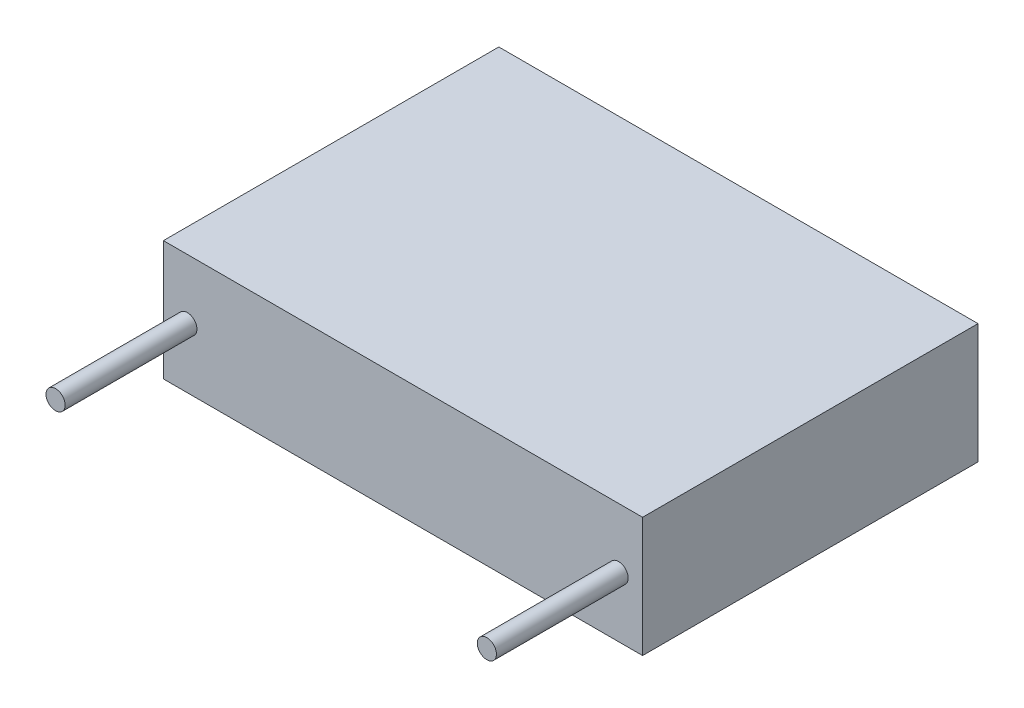
ISO-10303-21;
HEADER;
FILE_DESCRIPTION(('STEP AP214'),'2;1');
FILE_NAME('part.step','',(''),(''),'','','');
FILE_SCHEMA(('AUTOMOTIVE_DESIGN { 1 0 10303 214 1 1 1 1 }'));
ENDSEC;
DATA;
#1=APPLICATION_CONTEXT('core data for automotive mechanical design processes');
#2=APPLICATION_PROTOCOL_DEFINITION('international standard','automotive_design',2000,#1);
#3=PRODUCT_CONTEXT('',#1,'mechanical');
#4=PRODUCT('Part','Part','',(#3));
#5=PRODUCT_RELATED_PRODUCT_CATEGORY('part','',(#4));
#6=PRODUCT_DEFINITION_FORMATION('','',#4);
#7=PRODUCT_DEFINITION_CONTEXT('part definition',#1,'design');
#8=PRODUCT_DEFINITION('design','',#6,#7);
#9=PRODUCT_DEFINITION_SHAPE('','',#8);
#10=(LENGTH_UNIT() NAMED_UNIT(*) SI_UNIT(.MILLI.,.METRE.));
#11=(NAMED_UNIT(*) PLANE_ANGLE_UNIT() SI_UNIT($,.RADIAN.));
#12=(NAMED_UNIT(*) SI_UNIT($,.STERADIAN.) SOLID_ANGLE_UNIT());
#13=UNCERTAINTY_MEASURE_WITH_UNIT(LENGTH_MEASURE(1.E-05),#10,'distance_accuracy_value','');
#14=(GEOMETRIC_REPRESENTATION_CONTEXT(3) GLOBAL_UNCERTAINTY_ASSIGNED_CONTEXT((#13)) GLOBAL_UNIT_ASSIGNED_CONTEXT((#10,
#11,#12)) REPRESENTATION_CONTEXT('',''));
#15=CARTESIAN_POINT('',(0.,0.,0.));
#16=DIRECTION('',(0.,0.,1.));
#17=DIRECTION('',(1.,0.,0.));
#18=AXIS2_PLACEMENT_3D('',#15,#16,#17);
#19=CARTESIAN_POINT('',(0.,5.,14.));
#20=DIRECTION('',(0.,0.,-1.));
#21=DIRECTION('',(-1.,0.,0.));
#22=AXIS2_PLACEMENT_3D('',#19,#20,#21);
#23=PLANE('',#22);
#24=CARTESIAN_POINT('',(1.,2.5,14.));
#25=DIRECTION('',(0.,0.,-1.));
#26=DIRECTION('',(-1.,0.,0.));
#27=AXIS2_PLACEMENT_3D('',#24,#25,#26);
#28=CIRCLE('',#27,0.4);
#29=CARTESIAN_POINT('',(0.6,2.5,14.));
#30=VERTEX_POINT('',#29);
#31=EDGE_CURVE('E40',#30,#30,#28,.F.);
#32=ORIENTED_EDGE('',*,*,#31,.F.);
#33=EDGE_LOOP('',(#32));
#34=FACE_BOUND('',#33,.T.);
#35=DIRECTION('',(0.,-1.,0.));
#36=VECTOR('',#35,1.);
#37=CARTESIAN_POINT('',(0.,0.,14.));
#38=LINE('',#37,#36);
#39=CARTESIAN_POINT('',(0.,5.,14.));
#40=VERTEX_POINT('',#39);
#41=CARTESIAN_POINT('',(0.,0.,14.));
#42=VERTEX_POINT('',#41);
#43=EDGE_CURVE('E84',#40,#42,#38,.T.);
#44=ORIENTED_EDGE('',*,*,#43,.T.);
#45=DIRECTION('',(1.,0.,0.));
#46=VECTOR('',#45,1.);
#47=CARTESIAN_POINT('',(0.,0.,14.));
#48=LINE('',#47,#46);
#49=CARTESIAN_POINT('',(20.,0.,14.));
#50=VERTEX_POINT('',#49);
#51=EDGE_CURVE('E79',#42,#50,#48,.T.);
#52=ORIENTED_EDGE('',*,*,#51,.T.);
#53=DIRECTION('',(0.,1.,0.));
#54=VECTOR('',#53,1.);
#55=CARTESIAN_POINT('',(20.,0.,14.));
#56=LINE('',#55,#54);
#57=CARTESIAN_POINT('',(20.,5.,14.));
#58=VERTEX_POINT('',#57);
#59=EDGE_CURVE('E82',#50,#58,#56,.T.);
#60=ORIENTED_EDGE('',*,*,#59,.T.);
#61=DIRECTION('',(-1.,0.,0.));
#62=VECTOR('',#61,1.);
#63=CARTESIAN_POINT('',(0.,5.,14.));
#64=LINE('',#63,#62);
#65=EDGE_CURVE('E48',#58,#40,#64,.T.);
#66=ORIENTED_EDGE('',*,*,#65,.T.);
#67=EDGE_LOOP('',(#44,#52,#60,#66));
#68=FACE_BOUND('',#67,.T.);
#69=CARTESIAN_POINT('',(19.,2.5,14.));
#70=DIRECTION('',(0.,0.,-1.));
#71=DIRECTION('',(-1.,0.,0.));
#72=AXIS2_PLACEMENT_3D('',#69,#70,#71);
#73=CIRCLE('',#72,0.400000000000001);
#74=CARTESIAN_POINT('',(18.6,2.5,14.));
#75=VERTEX_POINT('',#74);
#76=EDGE_CURVE('E11',#75,#75,#73,.F.);
#77=ORIENTED_EDGE('',*,*,#76,.F.);
#78=EDGE_LOOP('',(#77));
#79=FACE_BOUND('',#78,.T.);
#80=ADVANCED_FACE('F31',(#34,#68,#79),#23,.F.);
#81=CARTESIAN_POINT('',(0.,0.,14.));
#82=DIRECTION('',(1.,0.,0.));
#83=DIRECTION('',(0.,0.,-1.));
#84=AXIS2_PLACEMENT_3D('',#81,#82,#83);
#85=PLANE('',#84);
#86=DIRECTION('',(0.,-1.,0.));
#87=VECTOR('',#86,1.);
#88=CARTESIAN_POINT('',(0.,0.,0.));
#89=LINE('',#88,#87);
#90=CARTESIAN_POINT('',(0.,5.,0.));
#91=VERTEX_POINT('',#90);
#92=CARTESIAN_POINT('',(0.,0.,0.));
#93=VERTEX_POINT('',#92);
#94=EDGE_CURVE('E99',#91,#93,#89,.T.);
#95=ORIENTED_EDGE('',*,*,#94,.T.);
#96=DIRECTION('',(0.,0.,-1.));
#97=VECTOR('',#96,1.);
#98=CARTESIAN_POINT('',(0.,0.,14.));
#99=LINE('',#98,#97);
#100=EDGE_CURVE('E90',#42,#93,#99,.T.);
#101=ORIENTED_EDGE('',*,*,#100,.F.);
#102=ORIENTED_EDGE('',*,*,#43,.F.);
#103=DIRECTION('',(0.,0.,-1.));
#104=VECTOR('',#103,1.);
#105=CARTESIAN_POINT('',(0.,5.,14.));
#106=LINE('',#105,#104);
#107=EDGE_CURVE('E95',#40,#91,#106,.T.);
#108=ORIENTED_EDGE('',*,*,#107,.T.);
#109=EDGE_LOOP('',(#95,#101,#102,#108));
#110=FACE_BOUND('',#109,.T.);
#111=ADVANCED_FACE('F33',(#110),#85,.F.);
#112=CARTESIAN_POINT('',(0.,0.,14.));
#113=DIRECTION('',(0.,1.,0.));
#114=DIRECTION('',(0.,0.,1.));
#115=AXIS2_PLACEMENT_3D('',#112,#113,#114);
#116=PLANE('',#115);
#117=DIRECTION('',(1.,0.,0.));
#118=VECTOR('',#117,1.);
#119=CARTESIAN_POINT('',(0.,0.,0.));
#120=LINE('',#119,#118);
#121=CARTESIAN_POINT('',(20.,0.,0.));
#122=VERTEX_POINT('',#121);
#123=EDGE_CURVE('E89',#93,#122,#120,.T.);
#124=ORIENTED_EDGE('',*,*,#123,.T.);
#125=DIRECTION('',(0.,0.,-1.));
#126=VECTOR('',#125,1.);
#127=CARTESIAN_POINT('',(20.,0.,14.));
#128=LINE('',#127,#126);
#129=EDGE_CURVE('E87',#50,#122,#128,.T.);
#130=ORIENTED_EDGE('',*,*,#129,.F.);
#131=ORIENTED_EDGE('',*,*,#51,.F.);
#132=ORIENTED_EDGE('',*,*,#100,.T.);
#133=EDGE_LOOP('',(#124,#130,#131,#132));
#134=FACE_BOUND('',#133,.T.);
#135=ADVANCED_FACE('F88',(#134),#116,.F.);
#136=CARTESIAN_POINT('',(20.,0.,14.));
#137=DIRECTION('',(-1.,0.,0.));
#138=DIRECTION('',(0.,0.,1.));
#139=AXIS2_PLACEMENT_3D('',#136,#137,#138);
#140=PLANE('',#139);
#141=DIRECTION('',(0.,1.,0.));
#142=VECTOR('',#141,1.);
#143=CARTESIAN_POINT('',(20.,0.,0.));
#144=LINE('',#143,#142);
#145=CARTESIAN_POINT('',(20.,5.,0.));
#146=VERTEX_POINT('',#145);
#147=EDGE_CURVE('E65',#122,#146,#144,.T.);
#148=ORIENTED_EDGE('',*,*,#147,.T.);
#149=DIRECTION('',(0.,0.,-1.));
#150=VECTOR('',#149,1.);
#151=CARTESIAN_POINT('',(20.,5.,14.));
#152=LINE('',#151,#150);
#153=EDGE_CURVE('E91',#58,#146,#152,.T.);
#154=ORIENTED_EDGE('',*,*,#153,.F.);
#155=ORIENTED_EDGE('',*,*,#59,.F.);
#156=ORIENTED_EDGE('',*,*,#129,.T.);
#157=EDGE_LOOP('',(#148,#154,#155,#156));
#158=FACE_BOUND('',#157,.T.);
#159=ADVANCED_FACE('F93',(#158),#140,.F.);
#160=CARTESIAN_POINT('',(0.,5.,14.));
#161=DIRECTION('',(0.,-1.,0.));
#162=DIRECTION('',(0.,0.,-1.));
#163=AXIS2_PLACEMENT_3D('',#160,#161,#162);
#164=PLANE('',#163);
#165=DIRECTION('',(-1.,0.,0.));
#166=VECTOR('',#165,1.);
#167=CARTESIAN_POINT('',(0.,5.,0.));
#168=LINE('',#167,#166);
#169=EDGE_CURVE('E71',#146,#91,#168,.T.);
#170=ORIENTED_EDGE('',*,*,#169,.T.);
#171=ORIENTED_EDGE('',*,*,#107,.F.);
#172=ORIENTED_EDGE('',*,*,#65,.F.);
#173=ORIENTED_EDGE('',*,*,#153,.T.);
#174=EDGE_LOOP('',(#170,#171,#172,#173));
#175=FACE_BOUND('',#174,.T.);
#176=ADVANCED_FACE('F125',(#175),#164,.F.);
#177=CARTESIAN_POINT('',(0.,5.,0.));
#178=DIRECTION('',(0.,0.,-1.));
#179=DIRECTION('',(-1.,0.,0.));
#180=AXIS2_PLACEMENT_3D('',#177,#178,#179);
#181=PLANE('',#180);
#182=ORIENTED_EDGE('',*,*,#94,.F.);
#183=ORIENTED_EDGE('',*,*,#169,.F.);
#184=ORIENTED_EDGE('',*,*,#147,.F.);
#185=ORIENTED_EDGE('',*,*,#123,.F.);
#186=EDGE_LOOP('',(#182,#183,#184,#185));
#187=FACE_BOUND('',#186,.T.);
#188=ADVANCED_FACE('F122',(#187),#181,.T.);
#189=CARTESIAN_POINT('',(1.,2.5,19.5));
#190=DIRECTION('',(0.,0.,-1.));
#191=DIRECTION('',(-1.,0.,0.));
#192=AXIS2_PLACEMENT_3D('',#189,#190,#191);
#193=CYLINDRICAL_SURFACE('',#192,0.4);
#194=CARTESIAN_POINT('',(1.,2.5,19.5));
#195=DIRECTION('',(0.,0.,1.));
#196=DIRECTION('',(1.,0.,0.));
#197=AXIS2_PLACEMENT_3D('',#194,#195,#196);
#198=CIRCLE('',#197,0.4);
#199=CARTESIAN_POINT('',(1.4,2.5,19.5));
#200=VERTEX_POINT('',#199);
#201=EDGE_CURVE('E102',#200,#200,#198,.T.);
#202=ORIENTED_EDGE('',*,*,#201,.F.);
#203=EDGE_LOOP('',(#202));
#204=FACE_BOUND('',#203,.T.);
#205=ORIENTED_EDGE('',*,*,#31,.T.);
#206=EDGE_LOOP('',(#205));
#207=FACE_BOUND('',#206,.T.);
#208=ADVANCED_FACE('F111',(#204,#207),#193,.T.);
#209=CARTESIAN_POINT('',(1.,2.5,19.5));
#210=DIRECTION('',(0.,0.,1.));
#211=DIRECTION('',(1.,0.,0.));
#212=AXIS2_PLACEMENT_3D('',#209,#210,#211);
#213=PLANE('',#212);
#214=ORIENTED_EDGE('',*,*,#201,.T.);
#215=EDGE_LOOP('',(#214));
#216=FACE_BOUND('',#215,.T.);
#217=ADVANCED_FACE('F153',(#216),#213,.T.);
#218=CARTESIAN_POINT('',(19.,2.5,19.5));
#219=DIRECTION('',(0.,0.,-1.));
#220=DIRECTION('',(-1.,0.,0.));
#221=AXIS2_PLACEMENT_3D('',#218,#219,#220);
#222=CYLINDRICAL_SURFACE('',#221,0.400000000000001);
#223=CARTESIAN_POINT('',(19.,2.5,19.5));
#224=DIRECTION('',(0.,0.,1.));
#225=DIRECTION('',(1.,0.,0.));
#226=AXIS2_PLACEMENT_3D('',#223,#224,#225);
#227=CIRCLE('',#226,0.400000000000001);
#228=CARTESIAN_POINT('',(19.4,2.5,19.5));
#229=VERTEX_POINT('',#228);
#230=EDGE_CURVE('E204',#229,#229,#227,.T.);
#231=ORIENTED_EDGE('',*,*,#230,.F.);
#232=EDGE_LOOP('',(#231));
#233=FACE_BOUND('',#232,.T.);
#234=ORIENTED_EDGE('',*,*,#76,.T.);
#235=EDGE_LOOP('',(#234));
#236=FACE_BOUND('',#235,.T.);
#237=ADVANCED_FACE('F160',(#233,#236),#222,.T.);
#238=CARTESIAN_POINT('',(19.,2.5,19.5));
#239=DIRECTION('',(0.,0.,1.));
#240=DIRECTION('',(1.,0.,0.));
#241=AXIS2_PLACEMENT_3D('',#238,#239,#240);
#242=PLANE('',#241);
#243=ORIENTED_EDGE('',*,*,#230,.T.);
#244=EDGE_LOOP('',(#243));
#245=FACE_BOUND('',#244,.T.);
#246=ADVANCED_FACE('F167',(#245),#242,.T.);
#247=CLOSED_SHELL('',(#80,#111,#135,#159,#176,#188,#208,#217,#237,#246));
#248=MANIFOLD_SOLID_BREP('B2',#247);
#249=ADVANCED_BREP_SHAPE_REPRESENTATION('',(#18,#248),#14);
#250=SHAPE_DEFINITION_REPRESENTATION(#9,#249);
ENDSEC;
END-ISO-10303-21;
